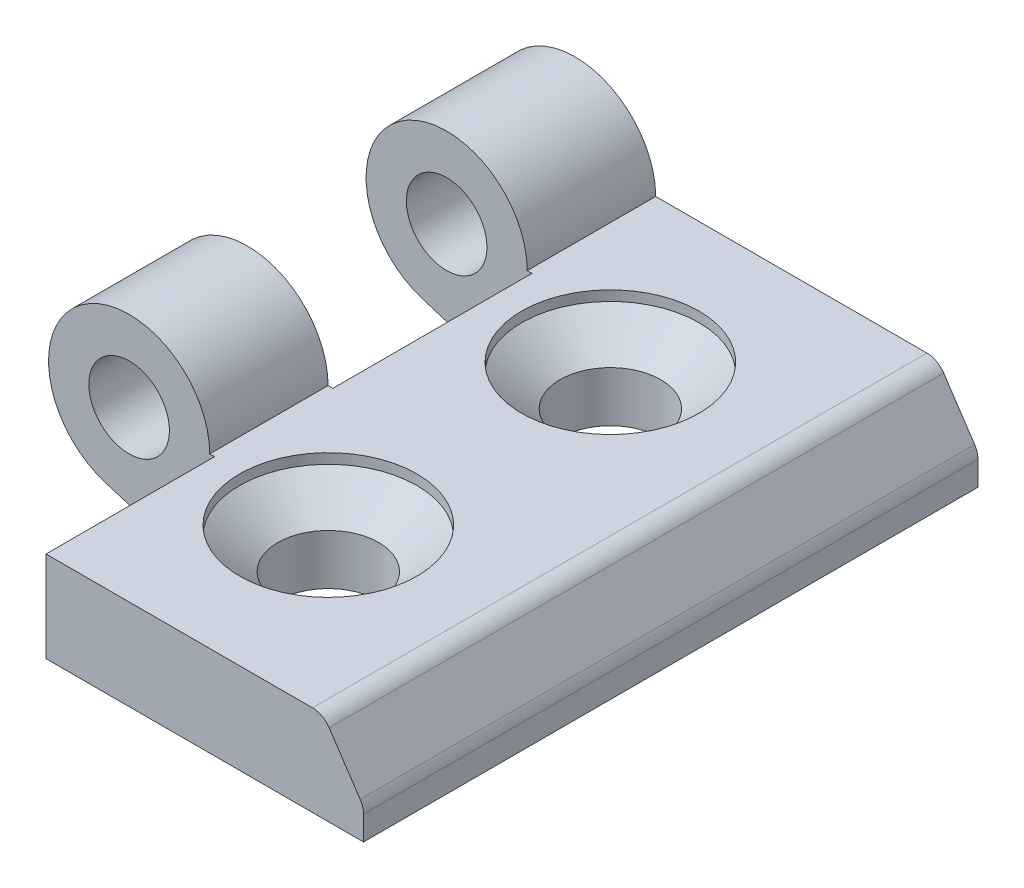
ISO-10303-21;
HEADER;
FILE_DESCRIPTION(('STEP AP214'),'2;1');
FILE_NAME('part.step','',(''),(''),'','','');
FILE_SCHEMA(('AUTOMOTIVE_DESIGN { 1 0 10303 214 1 1 1 1 }'));
ENDSEC;
DATA;
#1=APPLICATION_CONTEXT('core data for automotive mechanical design processes');
#2=APPLICATION_PROTOCOL_DEFINITION('international standard','automotive_design',2000,#1);
#3=PRODUCT_CONTEXT('',#1,'mechanical');
#4=PRODUCT('Part','Part','',(#3));
#5=PRODUCT_RELATED_PRODUCT_CATEGORY('part','',(#4));
#6=PRODUCT_DEFINITION_FORMATION('','',#4);
#7=PRODUCT_DEFINITION_CONTEXT('part definition',#1,'design');
#8=PRODUCT_DEFINITION('design','',#6,#7);
#9=PRODUCT_DEFINITION_SHAPE('','',#8);
#10=(LENGTH_UNIT() NAMED_UNIT(*) SI_UNIT(.MILLI.,.METRE.));
#11=(NAMED_UNIT(*) PLANE_ANGLE_UNIT() SI_UNIT($,.RADIAN.));
#12=(NAMED_UNIT(*) SI_UNIT($,.STERADIAN.) SOLID_ANGLE_UNIT());
#13=UNCERTAINTY_MEASURE_WITH_UNIT(LENGTH_MEASURE(1.E-05),#10,'distance_accuracy_value','');
#14=(GEOMETRIC_REPRESENTATION_CONTEXT(3) GLOBAL_UNCERTAINTY_ASSIGNED_CONTEXT((#13)) GLOBAL_UNIT_ASSIGNED_CONTEXT((#10,
#11,#12)) REPRESENTATION_CONTEXT('',''));
#15=CARTESIAN_POINT('',(0.,0.,0.));
#16=DIRECTION('',(0.,0.,1.));
#17=DIRECTION('',(1.,0.,0.));
#18=AXIS2_PLACEMENT_3D('',#15,#16,#17);
#19=CARTESIAN_POINT('',(0.,0.,15.25));
#20=DIRECTION('',(0.,0.,-1.));
#21=DIRECTION('',(-1.,0.,0.));
#22=AXIS2_PLACEMENT_3D('',#19,#20,#21);
#23=CYLINDRICAL_SURFACE('',#22,4.);
#24=DIRECTION('',(0.,0.,-1.));
#25=VECTOR('',#24,1.);
#26=CARTESIAN_POINT('',(-1.18791441198111,-3.8195365359959,15.25));
#27=LINE('',#26,#25);
#28=CARTESIAN_POINT('',(-1.18791441198111,-3.8195365359959,-8.875));
#29=VERTEX_POINT('',#28);
#30=CARTESIAN_POINT('',(-1.18791441198111,-3.8195365359959,-15.25));
#31=VERTEX_POINT('',#30);
#32=EDGE_CURVE('E255',#29,#31,#27,.T.);
#33=ORIENTED_EDGE('',*,*,#32,.F.);
#34=CARTESIAN_POINT('',(0.,0.,-8.875));
#35=DIRECTION('',(0.,0.,-1.));
#36=DIRECTION('',(-1.,0.,0.));
#37=AXIS2_PLACEMENT_3D('',#34,#35,#36);
#38=CIRCLE('',#37,4.);
#39=CARTESIAN_POINT('',(4.,0.,-8.875));
#40=VERTEX_POINT('',#39);
#41=EDGE_CURVE('E178',#29,#40,#38,.T.);
#42=ORIENTED_EDGE('',*,*,#41,.T.);
#43=DIRECTION('',(0.,0.,-1.));
#44=VECTOR('',#43,1.);
#45=CARTESIAN_POINT('',(4.,0.,15.25));
#46=LINE('',#45,#44);
#47=CARTESIAN_POINT('',(4.,0.,-15.25));
#48=VERTEX_POINT('',#47);
#49=EDGE_CURVE('E259',#40,#48,#46,.T.);
#50=ORIENTED_EDGE('',*,*,#49,.T.);
#51=CARTESIAN_POINT('',(0.,0.,-15.25));
#52=DIRECTION('',(0.,0.,1.));
#53=DIRECTION('',(1.,0.,0.));
#54=AXIS2_PLACEMENT_3D('',#51,#52,#53);
#55=CIRCLE('',#54,4.);
#56=EDGE_CURVE('E223',#48,#31,#55,.T.);
#57=ORIENTED_EDGE('',*,*,#56,.T.);
#58=EDGE_LOOP('',(#33,#42,#50,#57));
#59=FACE_BOUND('',#58,.T.);
#60=ADVANCED_FACE('F35',(#59),#23,.T.);
#61=CARTESIAN_POINT('',(-1.1879144119813,-3.81953653599584,15.25));
#62=DIRECTION('',(-0.296978602995324,-0.954884133998961,0.));
#63=DIRECTION('',(0.954884133998961,-0.296978602995324,0.));
#64=AXIS2_PLACEMENT_3D('',#61,#62,#63);
#65=PLANE('',#64);
#66=DIRECTION('',(0.954884133998961,-0.296978602995324,0.));
#67=VECTOR('',#66,1.);
#68=CARTESIAN_POINT('',(-1.1879144119813,-3.81953653599584,-8.875));
#69=LINE('',#68,#67);
#70=CARTESIAN_POINT('',(1.,-4.5,-8.875));
#71=VERTEX_POINT('',#70);
#72=EDGE_CURVE('E155',#29,#71,#69,.T.);
#73=ORIENTED_EDGE('',*,*,#72,.F.);
#74=ORIENTED_EDGE('',*,*,#32,.T.);
#75=DIRECTION('',(-0.954884133998961,0.296978602995324,0.));
#76=VECTOR('',#75,1.);
#77=CARTESIAN_POINT('',(-1.1879144119813,-3.81953653599584,-15.25));
#78=LINE('',#77,#76);
#79=CARTESIAN_POINT('',(1.,-4.5,-15.25));
#80=VERTEX_POINT('',#79);
#81=EDGE_CURVE('E226',#80,#31,#78,.T.);
#82=ORIENTED_EDGE('',*,*,#81,.F.);
#83=DIRECTION('',(0.,0.,-1.));
#84=VECTOR('',#83,1.);
#85=CARTESIAN_POINT('',(1.,-4.5,15.25));
#86=LINE('',#85,#84);
#87=EDGE_CURVE('E252',#71,#80,#86,.T.);
#88=ORIENTED_EDGE('',*,*,#87,.F.);
#89=EDGE_LOOP('',(#73,#74,#82,#88));
#90=FACE_BOUND('',#89,.T.);
#91=ADVANCED_FACE('F295',(#90),#65,.T.);
#92=CARTESIAN_POINT('',(0.,0.,15.25));
#93=DIRECTION('',(0.,-1.,0.));
#94=DIRECTION('',(0.,0.,-1.));
#95=AXIS2_PLACEMENT_3D('',#92,#93,#94);
#96=PLANE('',#95);
#97=CARTESIAN_POINT('',(10.,0.,-7.));
#98=DIRECTION('',(0.,-1.,0.));
#99=DIRECTION('',(0.,0.,-1.));
#100=AXIS2_PLACEMENT_3D('',#97,#98,#99);
#101=CIRCLE('',#100,4.4);
#102=CARTESIAN_POINT('',(10.,0.,-11.4));
#103=VERTEX_POINT('',#102);
#104=EDGE_CURVE('E503',#103,#103,#101,.T.);
#105=ORIENTED_EDGE('',*,*,#104,.T.);
#106=EDGE_LOOP('',(#105));
#107=FACE_BOUND('',#106,.T.);
#108=CARTESIAN_POINT('',(10.,0.,7.));
#109=DIRECTION('',(0.,-1.,0.));
#110=DIRECTION('',(0.,0.,-1.));
#111=AXIS2_PLACEMENT_3D('',#108,#109,#110);
#112=CIRCLE('',#111,4.4);
#113=CARTESIAN_POINT('',(10.,0.,2.6));
#114=VERTEX_POINT('',#113);
#115=EDGE_CURVE('E516',#114,#114,#112,.T.);
#116=ORIENTED_EDGE('',*,*,#115,.T.);
#117=EDGE_LOOP('',(#116));
#118=FACE_BOUND('',#117,.T.);
#119=ORIENTED_EDGE('',*,*,#49,.F.);
#120=DIRECTION('',(1.,0.,0.));
#121=VECTOR('',#120,1.);
#122=CARTESIAN_POINT('',(0.,0.,-8.875));
#123=LINE('',#122,#121);
#124=CARTESIAN_POINT('',(4.23816539343064,0.,-8.875));
#125=VERTEX_POINT('',#124);
#126=EDGE_CURVE('E181',#40,#125,#123,.T.);
#127=ORIENTED_EDGE('',*,*,#126,.T.);
#128=DIRECTION('',(0.,0.,1.));
#129=VECTOR('',#128,1.);
#130=CARTESIAN_POINT('',(4.23816539343064,0.,15.25));
#131=LINE('',#130,#129);
#132=CARTESIAN_POINT('',(4.23816539343064,0.,1.01));
#133=VERTEX_POINT('',#132);
#134=EDGE_CURVE('E145',#125,#133,#131,.T.);
#135=ORIENTED_EDGE('',*,*,#134,.T.);
#136=DIRECTION('',(-1.,0.,0.));
#137=VECTOR('',#136,1.);
#138=CARTESIAN_POINT('',(0.,0.,1.01));
#139=LINE('',#138,#137);
#140=CARTESIAN_POINT('',(4.,0.,1.01));
#141=VERTEX_POINT('',#140);
#142=EDGE_CURVE('E173',#133,#141,#139,.T.);
#143=ORIENTED_EDGE('',*,*,#142,.T.);
#144=CARTESIAN_POINT('',(4.,0.,6.885));
#145=VERTEX_POINT('',#144);
#146=EDGE_CURVE('E44',#145,#141,#46,.T.);
#147=ORIENTED_EDGE('',*,*,#146,.F.);
#148=DIRECTION('',(1.,0.,0.));
#149=VECTOR('',#148,1.);
#150=CARTESIAN_POINT('',(0.,0.,6.885));
#151=LINE('',#150,#149);
#152=CARTESIAN_POINT('',(4.23816539343069,0.,6.885));
#153=VERTEX_POINT('',#152);
#154=EDGE_CURVE('E200',#145,#153,#151,.T.);
#155=ORIENTED_EDGE('',*,*,#154,.T.);
#156=DIRECTION('',(0.,0.,1.));
#157=VECTOR('',#156,1.);
#158=CARTESIAN_POINT('',(4.23816539343069,0.,15.25));
#159=LINE('',#158,#157);
#160=CARTESIAN_POINT('',(4.23816539343069,0.,15.25));
#161=VERTEX_POINT('',#160);
#162=EDGE_CURVE('E191',#153,#161,#159,.T.);
#163=ORIENTED_EDGE('',*,*,#162,.T.);
#164=DIRECTION('',(-1.,0.,0.));
#165=VECTOR('',#164,1.);
#166=CARTESIAN_POINT('',(0.,0.,15.25));
#167=LINE('',#166,#165);
#168=CARTESIAN_POINT('',(17.4648162415119,0.,15.25));
#169=VERTEX_POINT('',#168);
#170=EDGE_CURVE('E204',#169,#161,#167,.T.);
#171=ORIENTED_EDGE('',*,*,#170,.F.);
#172=DIRECTION('',(0.,0.,-1.));
#173=VECTOR('',#172,1.);
#174=CARTESIAN_POINT('',(17.4648162415119,0.,15.25));
#175=LINE('',#174,#173);
#176=CARTESIAN_POINT('',(17.4648162415119,0.,-15.25));
#177=VERTEX_POINT('',#176);
#178=EDGE_CURVE('E220',#169,#177,#175,.T.);
#179=ORIENTED_EDGE('',*,*,#178,.T.);
#180=DIRECTION('',(-1.,0.,0.));
#181=VECTOR('',#180,1.);
#182=CARTESIAN_POINT('',(0.,0.,-15.25));
#183=LINE('',#182,#181);
#184=EDGE_CURVE('E203',#177,#48,#183,.T.);
#185=ORIENTED_EDGE('',*,*,#184,.T.);
#186=EDGE_LOOP('',(#119,#127,#135,#143,#147,#155,#163,#171,#179,#185));
#187=FACE_BOUND('',#186,.T.);
#188=ADVANCED_FACE('F37',(#107,#118,#187),#96,.F.);
#189=CARTESIAN_POINT('',(0.,0.,1.01));
#190=DIRECTION('',(0.,0.,1.));
#191=DIRECTION('',(1.,0.,0.));
#192=AXIS2_PLACEMENT_3D('',#189,#190,#191);
#193=CIRCLE('',#192,4.);
#194=CARTESIAN_POINT('',(-1.18791441198111,-3.8195365359959,1.01));
#195=VERTEX_POINT('',#194);
#196=EDGE_CURVE('E171',#141,#195,#193,.T.);
#197=ORIENTED_EDGE('',*,*,#196,.T.);
#198=CARTESIAN_POINT('',(-1.18791441198111,-3.8195365359959,6.885));
#199=VERTEX_POINT('',#198);
#200=EDGE_CURVE('E256',#199,#195,#27,.T.);
#201=ORIENTED_EDGE('',*,*,#200,.F.);
#202=CARTESIAN_POINT('',(0.,0.,6.885));
#203=DIRECTION('',(0.,0.,-1.));
#204=DIRECTION('',(-1.,0.,0.));
#205=AXIS2_PLACEMENT_3D('',#202,#203,#204);
#206=CIRCLE('',#205,4.);
#207=EDGE_CURVE('E197',#199,#145,#206,.T.);
#208=ORIENTED_EDGE('',*,*,#207,.T.);
#209=ORIENTED_EDGE('',*,*,#146,.T.);
#210=EDGE_LOOP('',(#197,#201,#208,#209));
#211=FACE_BOUND('',#210,.T.);
#212=ADVANCED_FACE('F303',(#211),#23,.T.);
#213=DIRECTION('',(-0.954884133998961,0.296978602995324,0.));
#214=VECTOR('',#213,1.);
#215=CARTESIAN_POINT('',(-1.1879144119813,-3.81953653599584,1.01));
#216=LINE('',#215,#214);
#217=CARTESIAN_POINT('',(1.,-4.5,1.01));
#218=VERTEX_POINT('',#217);
#219=EDGE_CURVE('E148',#218,#195,#216,.T.);
#220=ORIENTED_EDGE('',*,*,#219,.F.);
#221=CARTESIAN_POINT('',(1.,-4.5,6.885));
#222=VERTEX_POINT('',#221);
#223=EDGE_CURVE('E253',#222,#218,#86,.T.);
#224=ORIENTED_EDGE('',*,*,#223,.F.);
#225=DIRECTION('',(0.954884133998961,-0.296978602995324,0.));
#226=VECTOR('',#225,1.);
#227=CARTESIAN_POINT('',(-1.1879144119813,-3.81953653599584,6.885));
#228=LINE('',#227,#226);
#229=EDGE_CURVE('E195',#199,#222,#228,.T.);
#230=ORIENTED_EDGE('',*,*,#229,.F.);
#231=ORIENTED_EDGE('',*,*,#200,.T.);
#232=EDGE_LOOP('',(#220,#224,#230,#231));
#233=FACE_BOUND('',#232,.T.);
#234=ADVANCED_FACE('F298',(#233),#65,.T.);
#235=CARTESIAN_POINT('',(0.,-4.5,15.25));
#236=DIRECTION('',(0.,-1.,0.));
#237=DIRECTION('',(0.,0.,-1.));
#238=AXIS2_PLACEMENT_3D('',#235,#236,#237);
#239=PLANE('',#238);
#240=CARTESIAN_POINT('',(10.,-4.5,-7.));
#241=DIRECTION('',(0.,-1.,0.));
#242=DIRECTION('',(0.,0.,-1.));
#243=AXIS2_PLACEMENT_3D('',#240,#241,#242);
#244=CIRCLE('',#243,2.5);
#245=CARTESIAN_POINT('',(10.,-4.5,-9.5));
#246=VERTEX_POINT('',#245);
#247=EDGE_CURVE('E510',#246,#246,#244,.T.);
#248=ORIENTED_EDGE('',*,*,#247,.F.);
#249=EDGE_LOOP('',(#248));
#250=FACE_BOUND('',#249,.T.);
#251=CARTESIAN_POINT('',(10.,-4.5,7.));
#252=DIRECTION('',(0.,-1.,0.));
#253=DIRECTION('',(0.,0.,-1.));
#254=AXIS2_PLACEMENT_3D('',#251,#252,#253);
#255=CIRCLE('',#254,2.5);
#256=CARTESIAN_POINT('',(10.,-4.5,4.5));
#257=VERTEX_POINT('',#256);
#258=EDGE_CURVE('E525',#257,#257,#255,.T.);
#259=ORIENTED_EDGE('',*,*,#258,.F.);
#260=EDGE_LOOP('',(#259));
#261=FACE_BOUND('',#260,.T.);
#262=DIRECTION('',(-1.,0.,0.));
#263=VECTOR('',#262,1.);
#264=CARTESIAN_POINT('',(-4.00000000000005,-4.5,-8.875));
#265=LINE('',#264,#263);
#266=CARTESIAN_POINT('',(4.23816539343064,-4.5,-8.875));
#267=VERTEX_POINT('',#266);
#268=EDGE_CURVE('E152',#267,#71,#265,.T.);
#269=ORIENTED_EDGE('',*,*,#268,.T.);
#270=ORIENTED_EDGE('',*,*,#87,.T.);
#271=DIRECTION('',(-1.,0.,0.));
#272=VECTOR('',#271,1.);
#273=CARTESIAN_POINT('',(0.,-4.5,-15.25));
#274=LINE('',#273,#272);
#275=CARTESIAN_POINT('',(20.,-4.5,-15.25));
#276=VERTEX_POINT('',#275);
#277=EDGE_CURVE('E229',#276,#80,#274,.T.);
#278=ORIENTED_EDGE('',*,*,#277,.F.);
#279=DIRECTION('',(0.,0.,-1.));
#280=VECTOR('',#279,1.);
#281=CARTESIAN_POINT('',(20.,-4.5,15.25));
#282=LINE('',#281,#280);
#283=CARTESIAN_POINT('',(20.,-4.5,15.25));
#284=VERTEX_POINT('',#283);
#285=EDGE_CURVE('E250',#284,#276,#282,.T.);
#286=ORIENTED_EDGE('',*,*,#285,.F.);
#287=DIRECTION('',(-1.,0.,0.));
#288=VECTOR('',#287,1.);
#289=CARTESIAN_POINT('',(0.,-4.5,15.25));
#290=LINE('',#289,#288);
#291=CARTESIAN_POINT('',(4.23816539343069,-4.5,15.25));
#292=VERTEX_POINT('',#291);
#293=EDGE_CURVE('E207',#284,#292,#290,.T.);
#294=ORIENTED_EDGE('',*,*,#293,.T.);
#295=DIRECTION('',(0.,0.,-1.));
#296=VECTOR('',#295,1.);
#297=CARTESIAN_POINT('',(4.23816539343069,-4.5,15.25));
#298=LINE('',#297,#296);
#299=CARTESIAN_POINT('',(4.23816539343069,-4.5,6.885));
#300=VERTEX_POINT('',#299);
#301=EDGE_CURVE('E59',#292,#300,#298,.T.);
#302=ORIENTED_EDGE('',*,*,#301,.T.);
#303=DIRECTION('',(-1.,0.,0.));
#304=VECTOR('',#303,1.);
#305=CARTESIAN_POINT('',(-4.,-4.5,6.885));
#306=LINE('',#305,#304);
#307=EDGE_CURVE('E184',#300,#222,#306,.T.);
#308=ORIENTED_EDGE('',*,*,#307,.T.);
#309=ORIENTED_EDGE('',*,*,#223,.T.);
#310=DIRECTION('',(-1.,0.,0.));
#311=VECTOR('',#310,1.);
#312=CARTESIAN_POINT('',(0.,-4.5,1.01));
#313=LINE('',#312,#311);
#314=CARTESIAN_POINT('',(4.23816539343064,-4.5,1.01));
#315=VERTEX_POINT('',#314);
#316=EDGE_CURVE('E11',#315,#218,#313,.T.);
#317=ORIENTED_EDGE('',*,*,#316,.F.);
#318=DIRECTION('',(0.,0.,-1.));
#319=VECTOR('',#318,1.);
#320=CARTESIAN_POINT('',(4.23816539343064,-4.5,1.01));
#321=LINE('',#320,#319);
#322=EDGE_CURVE('E51',#315,#267,#321,.T.);
#323=ORIENTED_EDGE('',*,*,#322,.T.);
#324=EDGE_LOOP('',(#269,#270,#278,#286,#294,#302,#308,#309,#317,#323));
#325=FACE_BOUND('',#324,.T.);
#326=ADVANCED_FACE('F160',(#250,#261,#325),#239,.T.);
#327=CARTESIAN_POINT('',(20.0000000000009,-3.8252395464981E-12,15.25));
#328=DIRECTION('',(1.,-1.91261977324897E-13,0.));
#329=DIRECTION('',(1.91261977324897E-13,1.,0.));
#330=AXIS2_PLACEMENT_3D('',#327,#328,#329);
#331=PLANE('',#330);
#332=DIRECTION('',(-1.91261977324897E-13,-1.,0.));
#333=VECTOR('',#332,1.);
#334=CARTESIAN_POINT('',(20.0000000000009,-3.8252395464981E-12,-15.25));
#335=LINE('',#334,#333);
#336=CARTESIAN_POINT('',(20.0000000000002,-3.30277563773188,-15.25));
#337=VERTEX_POINT('',#336);
#338=EDGE_CURVE('E232',#337,#276,#335,.T.);
#339=ORIENTED_EDGE('',*,*,#338,.F.);
#340=DIRECTION('',(0.,0.,-1.));
#341=VECTOR('',#340,1.);
#342=CARTESIAN_POINT('',(20.0000000000002,-3.30277563773188,15.25));
#343=LINE('',#342,#341);
#344=CARTESIAN_POINT('',(20.0000000000002,-3.30277563773188,15.25));
#345=VERTEX_POINT('',#344);
#346=EDGE_CURVE('E248',#345,#337,#343,.T.);
#347=ORIENTED_EDGE('',*,*,#346,.F.);
#348=DIRECTION('',(-1.91261977324897E-13,-1.,0.));
#349=VECTOR('',#348,1.);
#350=CARTESIAN_POINT('',(20.0000000000009,-3.8252395464981E-12,15.25));
#351=LINE('',#350,#349);
#352=EDGE_CURVE('E211',#345,#284,#351,.T.);
#353=ORIENTED_EDGE('',*,*,#352,.T.);
#354=ORIENTED_EDGE('',*,*,#285,.T.);
#355=EDGE_LOOP('',(#339,#347,#353,#354));
#356=FACE_BOUND('',#355,.T.);
#357=ADVANCED_FACE('F291',(#356),#331,.T.);
#358=CARTESIAN_POINT('',(19.0000000000002,-3.30277563773188,15.25));
#359=DIRECTION('',(0.,0.,-1.));
#360=DIRECTION('',(-1.,0.,0.));
#361=AXIS2_PLACEMENT_3D('',#358,#359,#360);
#362=CYLINDRICAL_SURFACE('',#361,1.);
#363=CARTESIAN_POINT('',(19.0000000000002,-3.30277563773188,-15.25));
#364=DIRECTION('',(0.,0.,1.));
#365=DIRECTION('',(1.,0.,0.));
#366=AXIS2_PLACEMENT_3D('',#363,#364,#365);
#367=CIRCLE('',#366,1.);
#368=CARTESIAN_POINT('',(19.8320502943381,-2.74807544150671,-15.25));
#369=VERTEX_POINT('',#368);
#370=EDGE_CURVE('E235',#337,#369,#367,.T.);
#371=ORIENTED_EDGE('',*,*,#370,.T.);
#372=DIRECTION('',(0.,0.,-1.));
#373=VECTOR('',#372,1.);
#374=CARTESIAN_POINT('',(19.8320502943381,-2.74807544150671,15.25));
#375=LINE('',#374,#373);
#376=CARTESIAN_POINT('',(19.8320502943381,-2.74807544150671,15.25));
#377=VERTEX_POINT('',#376);
#378=EDGE_CURVE('E245',#377,#369,#375,.T.);
#379=ORIENTED_EDGE('',*,*,#378,.F.);
#380=CARTESIAN_POINT('',(19.0000000000002,-3.30277563773188,15.25));
#381=DIRECTION('',(0.,0.,1.));
#382=DIRECTION('',(1.,0.,0.));
#383=AXIS2_PLACEMENT_3D('',#380,#381,#382);
#384=CIRCLE('',#383,1.);
#385=EDGE_CURVE('E214',#345,#377,#384,.T.);
#386=ORIENTED_EDGE('',*,*,#385,.F.);
#387=ORIENTED_EDGE('',*,*,#346,.T.);
#388=EDGE_LOOP('',(#371,#379,#386,#387));
#389=FACE_BOUND('',#388,.T.);
#390=ADVANCED_FACE('F288',(#389),#362,.T.);
#391=CARTESIAN_POINT('',(12.4615384615365,8.30769230769303,15.25));
#392=DIRECTION('',(-0.83205029433778,-0.554700196225324,0.));
#393=DIRECTION('',(0.554700196225324,-0.83205029433778,0.));
#394=AXIS2_PLACEMENT_3D('',#391,#392,#393);
#395=PLANE('',#394);
#396=DIRECTION('',(-0.554700196225324,0.83205029433778,0.));
#397=VECTOR('',#396,1.);
#398=CARTESIAN_POINT('',(12.4615384615365,8.30769230769303,-15.25));
#399=LINE('',#398,#397);
#400=CARTESIAN_POINT('',(18.2968665358498,-0.445299803774822,-15.25));
#401=VERTEX_POINT('',#400);
#402=EDGE_CURVE('E237',#369,#401,#399,.T.);
#403=ORIENTED_EDGE('',*,*,#402,.T.);
#404=DIRECTION('',(0.,0.,-1.));
#405=VECTOR('',#404,1.);
#406=CARTESIAN_POINT('',(18.2968665358498,-0.445299803774822,15.25));
#407=LINE('',#406,#405);
#408=CARTESIAN_POINT('',(18.2968665358498,-0.445299803774822,15.25));
#409=VERTEX_POINT('',#408);
#410=EDGE_CURVE('E242',#409,#401,#407,.T.);
#411=ORIENTED_EDGE('',*,*,#410,.F.);
#412=DIRECTION('',(-0.554700196225324,0.83205029433778,0.));
#413=VECTOR('',#412,1.);
#414=CARTESIAN_POINT('',(12.4615384615365,8.30769230769303,15.25));
#415=LINE('',#414,#413);
#416=EDGE_CURVE('E216',#377,#409,#415,.T.);
#417=ORIENTED_EDGE('',*,*,#416,.F.);
#418=ORIENTED_EDGE('',*,*,#378,.T.);
#419=EDGE_LOOP('',(#403,#411,#417,#418));
#420=FACE_BOUND('',#419,.T.);
#421=ADVANCED_FACE('F283',(#420),#395,.F.);
#422=CARTESIAN_POINT('',(17.4648162415119,-1.,15.25));
#423=DIRECTION('',(0.,0.,-1.));
#424=DIRECTION('',(-1.,0.,0.));
#425=AXIS2_PLACEMENT_3D('',#422,#423,#424);
#426=CYLINDRICAL_SURFACE('',#425,1.);
#427=CARTESIAN_POINT('',(17.4648162415119,-1.,-15.25));
#428=DIRECTION('',(0.,0.,1.));
#429=DIRECTION('',(1.,0.,0.));
#430=AXIS2_PLACEMENT_3D('',#427,#428,#429);
#431=CIRCLE('',#430,1.);
#432=EDGE_CURVE('E208',#401,#177,#431,.T.);
#433=ORIENTED_EDGE('',*,*,#432,.T.);
#434=ORIENTED_EDGE('',*,*,#178,.F.);
#435=CARTESIAN_POINT('',(17.4648162415119,-1.,15.25));
#436=DIRECTION('',(0.,0.,1.));
#437=DIRECTION('',(1.,0.,0.));
#438=AXIS2_PLACEMENT_3D('',#435,#436,#437);
#439=CIRCLE('',#438,1.);
#440=EDGE_CURVE('E218',#409,#169,#439,.T.);
#441=ORIENTED_EDGE('',*,*,#440,.F.);
#442=ORIENTED_EDGE('',*,*,#410,.T.);
#443=EDGE_LOOP('',(#433,#434,#441,#442));
#444=FACE_BOUND('',#443,.T.);
#445=ADVANCED_FACE('F277',(#444),#426,.T.);
#446=CARTESIAN_POINT('',(0.,0.,15.25));
#447=DIRECTION('',(0.,0.,1.));
#448=DIRECTION('',(1.,0.,0.));
#449=AXIS2_PLACEMENT_3D('',#446,#447,#448);
#450=PLANE('',#449);
#451=DIRECTION('',(0.,1.,0.));
#452=VECTOR('',#451,1.);
#453=CARTESIAN_POINT('',(4.23816539343069,-4.5,15.25));
#454=LINE('',#453,#452);
#455=EDGE_CURVE('E187',#292,#161,#454,.T.);
#456=ORIENTED_EDGE('',*,*,#455,.F.);
#457=ORIENTED_EDGE('',*,*,#293,.F.);
#458=ORIENTED_EDGE('',*,*,#352,.F.);
#459=ORIENTED_EDGE('',*,*,#385,.T.);
#460=ORIENTED_EDGE('',*,*,#416,.T.);
#461=ORIENTED_EDGE('',*,*,#440,.T.);
#462=ORIENTED_EDGE('',*,*,#170,.T.);
#463=EDGE_LOOP('',(#456,#457,#458,#459,#460,#461,#462));
#464=FACE_BOUND('',#463,.T.);
#465=ADVANCED_FACE('F323',(#464),#450,.T.);
#466=CARTESIAN_POINT('',(0.,0.,-15.25));
#467=DIRECTION('',(0.,0.,1.));
#468=DIRECTION('',(1.,0.,0.));
#469=AXIS2_PLACEMENT_3D('',#466,#467,#468);
#470=PLANE('',#469);
#471=CARTESIAN_POINT('',(0.,0.,-15.25));
#472=DIRECTION('',(0.,0.,1.));
#473=DIRECTION('',(1.,0.,0.));
#474=AXIS2_PLACEMENT_3D('',#471,#472,#473);
#475=CIRCLE('',#474,2.);
#476=CARTESIAN_POINT('',(2.,0.,-15.25));
#477=VERTEX_POINT('',#476);
#478=EDGE_CURVE('E529',#477,#477,#475,.T.);
#479=ORIENTED_EDGE('',*,*,#478,.T.);
#480=EDGE_LOOP('',(#479));
#481=FACE_BOUND('',#480,.T.);
#482=ORIENTED_EDGE('',*,*,#184,.F.);
#483=ORIENTED_EDGE('',*,*,#432,.F.);
#484=ORIENTED_EDGE('',*,*,#402,.F.);
#485=ORIENTED_EDGE('',*,*,#370,.F.);
#486=ORIENTED_EDGE('',*,*,#338,.T.);
#487=ORIENTED_EDGE('',*,*,#277,.T.);
#488=ORIENTED_EDGE('',*,*,#81,.T.);
#489=ORIENTED_EDGE('',*,*,#56,.F.);
#490=EDGE_LOOP('',(#482,#483,#484,#485,#486,#487,#488,#489));
#491=FACE_BOUND('',#490,.T.);
#492=ADVANCED_FACE('F270',(#481,#491),#470,.F.);
#493=CARTESIAN_POINT('',(-4.,-4.5,6.885));
#494=DIRECTION('',(0.,0.,-1.));
#495=DIRECTION('',(-1.,0.,0.));
#496=AXIS2_PLACEMENT_3D('',#493,#494,#495);
#497=PLANE('',#496);
#498=CARTESIAN_POINT('',(0.,0.,6.885));
#499=DIRECTION('',(0.,0.,1.));
#500=DIRECTION('',(1.,0.,0.));
#501=AXIS2_PLACEMENT_3D('',#498,#499,#500);
#502=CIRCLE('',#501,2.);
#503=CARTESIAN_POINT('',(2.,0.,6.885));
#504=VERTEX_POINT('',#503);
#505=EDGE_CURVE('E528',#504,#504,#502,.T.);
#506=ORIENTED_EDGE('',*,*,#505,.F.);
#507=EDGE_LOOP('',(#506));
#508=FACE_BOUND('',#507,.T.);
#509=ORIENTED_EDGE('',*,*,#207,.F.);
#510=ORIENTED_EDGE('',*,*,#229,.T.);
#511=ORIENTED_EDGE('',*,*,#307,.F.);
#512=DIRECTION('',(0.,1.,0.));
#513=VECTOR('',#512,1.);
#514=CARTESIAN_POINT('',(4.23816539343069,-4.5,6.885));
#515=LINE('',#514,#513);
#516=EDGE_CURVE('E188',#300,#153,#515,.T.);
#517=ORIENTED_EDGE('',*,*,#516,.T.);
#518=ORIENTED_EDGE('',*,*,#154,.F.);
#519=EDGE_LOOP('',(#509,#510,#511,#517,#518));
#520=FACE_BOUND('',#519,.T.);
#521=ADVANCED_FACE('F320',(#508,#520),#497,.F.);
#522=CARTESIAN_POINT('',(4.23816539343069,-4.5,15.25));
#523=DIRECTION('',(1.,0.,0.));
#524=DIRECTION('',(0.,0.,-1.));
#525=AXIS2_PLACEMENT_3D('',#522,#523,#524);
#526=PLANE('',#525);
#527=ORIENTED_EDGE('',*,*,#516,.F.);
#528=ORIENTED_EDGE('',*,*,#301,.F.);
#529=ORIENTED_EDGE('',*,*,#455,.T.);
#530=ORIENTED_EDGE('',*,*,#162,.F.);
#531=EDGE_LOOP('',(#527,#528,#529,#530));
#532=FACE_BOUND('',#531,.T.);
#533=ADVANCED_FACE('F324',(#532),#526,.F.);
#534=CARTESIAN_POINT('',(-4.00000000000005,-4.5,-8.875));
#535=DIRECTION('',(0.,0.,-1.));
#536=DIRECTION('',(-1.,0.,0.));
#537=AXIS2_PLACEMENT_3D('',#534,#535,#536);
#538=PLANE('',#537);
#539=CARTESIAN_POINT('',(0.,0.,-8.875));
#540=DIRECTION('',(0.,0.,-1.));
#541=DIRECTION('',(-1.,0.,0.));
#542=AXIS2_PLACEMENT_3D('',#539,#540,#541);
#543=CIRCLE('',#542,2.);
#544=CARTESIAN_POINT('',(-2.,0.,-8.875));
#545=VERTEX_POINT('',#544);
#546=EDGE_CURVE('E162',#545,#545,#543,.T.);
#547=ORIENTED_EDGE('',*,*,#546,.T.);
#548=EDGE_LOOP('',(#547));
#549=FACE_BOUND('',#548,.T.);
#550=ORIENTED_EDGE('',*,*,#41,.F.);
#551=ORIENTED_EDGE('',*,*,#72,.T.);
#552=ORIENTED_EDGE('',*,*,#268,.F.);
#553=DIRECTION('',(0.,1.,0.));
#554=VECTOR('',#553,1.);
#555=CARTESIAN_POINT('',(4.23816539343064,-4.5,-8.875));
#556=LINE('',#555,#554);
#557=EDGE_CURVE('E141',#267,#125,#556,.T.);
#558=ORIENTED_EDGE('',*,*,#557,.T.);
#559=ORIENTED_EDGE('',*,*,#126,.F.);
#560=EDGE_LOOP('',(#550,#551,#552,#558,#559));
#561=FACE_BOUND('',#560,.T.);
#562=ADVANCED_FACE('F153',(#549,#561),#538,.F.);
#563=CARTESIAN_POINT('',(4.23816539343064,-4.5,1.01));
#564=DIRECTION('',(1.,0.,0.));
#565=DIRECTION('',(0.,0.,-1.));
#566=AXIS2_PLACEMENT_3D('',#563,#564,#565);
#567=PLANE('',#566);
#568=ORIENTED_EDGE('',*,*,#557,.F.);
#569=ORIENTED_EDGE('',*,*,#322,.F.);
#570=DIRECTION('',(0.,1.,0.));
#571=VECTOR('',#570,1.);
#572=CARTESIAN_POINT('',(4.23816539343064,-4.5,1.01));
#573=LINE('',#572,#571);
#574=EDGE_CURVE('E149',#315,#133,#573,.T.);
#575=ORIENTED_EDGE('',*,*,#574,.T.);
#576=ORIENTED_EDGE('',*,*,#134,.F.);
#577=EDGE_LOOP('',(#568,#569,#575,#576));
#578=FACE_BOUND('',#577,.T.);
#579=ADVANCED_FACE('F143',(#578),#567,.F.);
#580=CARTESIAN_POINT('',(-4.00000000000005,-4.5,1.01));
#581=DIRECTION('',(0.,0.,1.));
#582=DIRECTION('',(1.,0.,0.));
#583=AXIS2_PLACEMENT_3D('',#580,#581,#582);
#584=PLANE('',#583);
#585=CARTESIAN_POINT('',(0.,0.,1.01));
#586=DIRECTION('',(0.,0.,1.));
#587=DIRECTION('',(1.,0.,0.));
#588=AXIS2_PLACEMENT_3D('',#585,#586,#587);
#589=CIRCLE('',#588,2.);
#590=CARTESIAN_POINT('',(2.,0.,1.01));
#591=VERTEX_POINT('',#590);
#592=EDGE_CURVE('E39',#591,#591,#589,.T.);
#593=ORIENTED_EDGE('',*,*,#592,.T.);
#594=EDGE_LOOP('',(#593));
#595=FACE_BOUND('',#594,.T.);
#596=ORIENTED_EDGE('',*,*,#574,.F.);
#597=ORIENTED_EDGE('',*,*,#316,.T.);
#598=ORIENTED_EDGE('',*,*,#219,.T.);
#599=ORIENTED_EDGE('',*,*,#196,.F.);
#600=ORIENTED_EDGE('',*,*,#142,.F.);
#601=EDGE_LOOP('',(#596,#597,#598,#599,#600));
#602=FACE_BOUND('',#601,.T.);
#603=ADVANCED_FACE('F321',(#595,#602),#584,.F.);
#604=CARTESIAN_POINT('',(0.,0.,-15.25));
#605=DIRECTION('',(0.,0.,1.));
#606=DIRECTION('',(1.,0.,0.));
#607=AXIS2_PLACEMENT_3D('',#604,#605,#606);
#608=CYLINDRICAL_SURFACE('',#607,2.);
#609=ORIENTED_EDGE('',*,*,#505,.T.);
#610=EDGE_LOOP('',(#609));
#611=FACE_BOUND('',#610,.T.);
#612=ORIENTED_EDGE('',*,*,#592,.F.);
#613=EDGE_LOOP('',(#612));
#614=FACE_BOUND('',#613,.T.);
#615=ADVANCED_FACE('F398',(#611,#614),#608,.F.);
#616=ORIENTED_EDGE('',*,*,#478,.F.);
#617=EDGE_LOOP('',(#616));
#618=FACE_BOUND('',#617,.T.);
#619=ORIENTED_EDGE('',*,*,#546,.F.);
#620=EDGE_LOOP('',(#619));
#621=FACE_BOUND('',#620,.T.);
#622=ADVANCED_FACE('F407',(#618,#621),#608,.F.);
#623=CARTESIAN_POINT('',(10.,-4.5,7.));
#624=DIRECTION('',(0.,-1.,0.));
#625=DIRECTION('',(0.,0.,-1.));
#626=AXIS2_PLACEMENT_3D('',#623,#624,#625);
#627=CYLINDRICAL_SURFACE('',#626,2.5);
#628=CARTESIAN_POINT('',(10.,-2.,7.));
#629=DIRECTION('',(0.,-1.,0.));
#630=DIRECTION('',(0.,0.,-1.));
#631=AXIS2_PLACEMENT_3D('',#628,#629,#630);
#632=CIRCLE('',#631,2.5);
#633=CARTESIAN_POINT('',(10.,-2.,4.5));
#634=VERTEX_POINT('',#633);
#635=EDGE_CURVE('E522',#634,#634,#632,.T.);
#636=ORIENTED_EDGE('',*,*,#635,.F.);
#637=EDGE_LOOP('',(#636));
#638=FACE_BOUND('',#637,.T.);
#639=ORIENTED_EDGE('',*,*,#258,.T.);
#640=EDGE_LOOP('',(#639));
#641=FACE_BOUND('',#640,.T.);
#642=ADVANCED_FACE('F417',(#638,#641),#627,.F.);
#643=CARTESIAN_POINT('',(10.,-2.,7.));
#644=DIRECTION('',(0.,1.,0.));
#645=DIRECTION('',(0.,0.,1.));
#646=AXIS2_PLACEMENT_3D('',#643,#644,#645);
#647=CONICAL_SURFACE('',#646,2.5,0.902506907964312);
#648=CARTESIAN_POINT('',(10.,-0.5,7.));
#649=DIRECTION('',(0.,-1.,0.));
#650=DIRECTION('',(0.,0.,-1.));
#651=AXIS2_PLACEMENT_3D('',#648,#649,#650);
#652=CIRCLE('',#651,4.4);
#653=CARTESIAN_POINT('',(10.,-0.5,2.6));
#654=VERTEX_POINT('',#653);
#655=EDGE_CURVE('E519',#654,#654,#652,.T.);
#656=ORIENTED_EDGE('',*,*,#655,.F.);
#657=EDGE_LOOP('',(#656));
#658=FACE_BOUND('',#657,.T.);
#659=ORIENTED_EDGE('',*,*,#635,.T.);
#660=EDGE_LOOP('',(#659));
#661=FACE_BOUND('',#660,.T.);
#662=ADVANCED_FACE('F426',(#658,#661),#647,.F.);
#663=CARTESIAN_POINT('',(10.,-4.5,7.));
#664=DIRECTION('',(0.,-1.,0.));
#665=DIRECTION('',(0.,0.,-1.));
#666=AXIS2_PLACEMENT_3D('',#663,#664,#665);
#667=CYLINDRICAL_SURFACE('',#666,4.4);
#668=ORIENTED_EDGE('',*,*,#115,.F.);
#669=EDGE_LOOP('',(#668));
#670=FACE_BOUND('',#669,.T.);
#671=ORIENTED_EDGE('',*,*,#655,.T.);
#672=EDGE_LOOP('',(#671));
#673=FACE_BOUND('',#672,.T.);
#674=ADVANCED_FACE('F436',(#670,#673),#667,.F.);
#675=CARTESIAN_POINT('',(10.,-4.5,-7.));
#676=DIRECTION('',(0.,-1.,0.));
#677=DIRECTION('',(0.,0.,-1.));
#678=AXIS2_PLACEMENT_3D('',#675,#676,#677);
#679=CYLINDRICAL_SURFACE('',#678,2.5);
#680=CARTESIAN_POINT('',(10.,-2.,-7.));
#681=DIRECTION('',(0.,-1.,0.));
#682=DIRECTION('',(0.,0.,-1.));
#683=AXIS2_PLACEMENT_3D('',#680,#681,#682);
#684=CIRCLE('',#683,2.5);
#685=CARTESIAN_POINT('',(10.,-2.,-9.5));
#686=VERTEX_POINT('',#685);
#687=EDGE_CURVE('E507',#686,#686,#684,.T.);
#688=ORIENTED_EDGE('',*,*,#687,.F.);
#689=EDGE_LOOP('',(#688));
#690=FACE_BOUND('',#689,.T.);
#691=ORIENTED_EDGE('',*,*,#247,.T.);
#692=EDGE_LOOP('',(#691));
#693=FACE_BOUND('',#692,.T.);
#694=ADVANCED_FACE('F446',(#690,#693),#679,.F.);
#695=CARTESIAN_POINT('',(10.,-2.,-7.));
#696=DIRECTION('',(0.,1.,0.));
#697=DIRECTION('',(0.,0.,1.));
#698=AXIS2_PLACEMENT_3D('',#695,#696,#697);
#699=CONICAL_SURFACE('',#698,2.5,0.902506907964312);
#700=CARTESIAN_POINT('',(10.,-0.5,-7.));
#701=DIRECTION('',(0.,-1.,0.));
#702=DIRECTION('',(0.,0.,-1.));
#703=AXIS2_PLACEMENT_3D('',#700,#701,#702);
#704=CIRCLE('',#703,4.4);
#705=CARTESIAN_POINT('',(10.,-0.5,-11.4));
#706=VERTEX_POINT('',#705);
#707=EDGE_CURVE('E506',#706,#706,#704,.T.);
#708=ORIENTED_EDGE('',*,*,#707,.F.);
#709=EDGE_LOOP('',(#708));
#710=FACE_BOUND('',#709,.T.);
#711=ORIENTED_EDGE('',*,*,#687,.T.);
#712=EDGE_LOOP('',(#711));
#713=FACE_BOUND('',#712,.T.);
#714=ADVANCED_FACE('F468',(#710,#713),#699,.F.);
#715=CARTESIAN_POINT('',(10.,-4.5,-7.));
#716=DIRECTION('',(0.,-1.,0.));
#717=DIRECTION('',(0.,0.,-1.));
#718=AXIS2_PLACEMENT_3D('',#715,#716,#717);
#719=CYLINDRICAL_SURFACE('',#718,4.4);
#720=ORIENTED_EDGE('',*,*,#104,.F.);
#721=EDGE_LOOP('',(#720));
#722=FACE_BOUND('',#721,.T.);
#723=ORIENTED_EDGE('',*,*,#707,.T.);
#724=EDGE_LOOP('',(#723));
#725=FACE_BOUND('',#724,.T.);
#726=ADVANCED_FACE('F478',(#722,#725),#719,.F.);
#727=CLOSED_SHELL('',(#60,#91,#188,#212,#234,#326,#357,#390,#421,#445,#465,#492,#521,#533,#562,
#579,#603,#615,#622,#642,#662,#674,#694,#714,#726));
#728=MANIFOLD_SOLID_BREP('B2',#727);
#729=ADVANCED_BREP_SHAPE_REPRESENTATION('',(#18,#728),#14);
#730=SHAPE_DEFINITION_REPRESENTATION(#9,#729);
ENDSEC;
END-ISO-10303-21;
